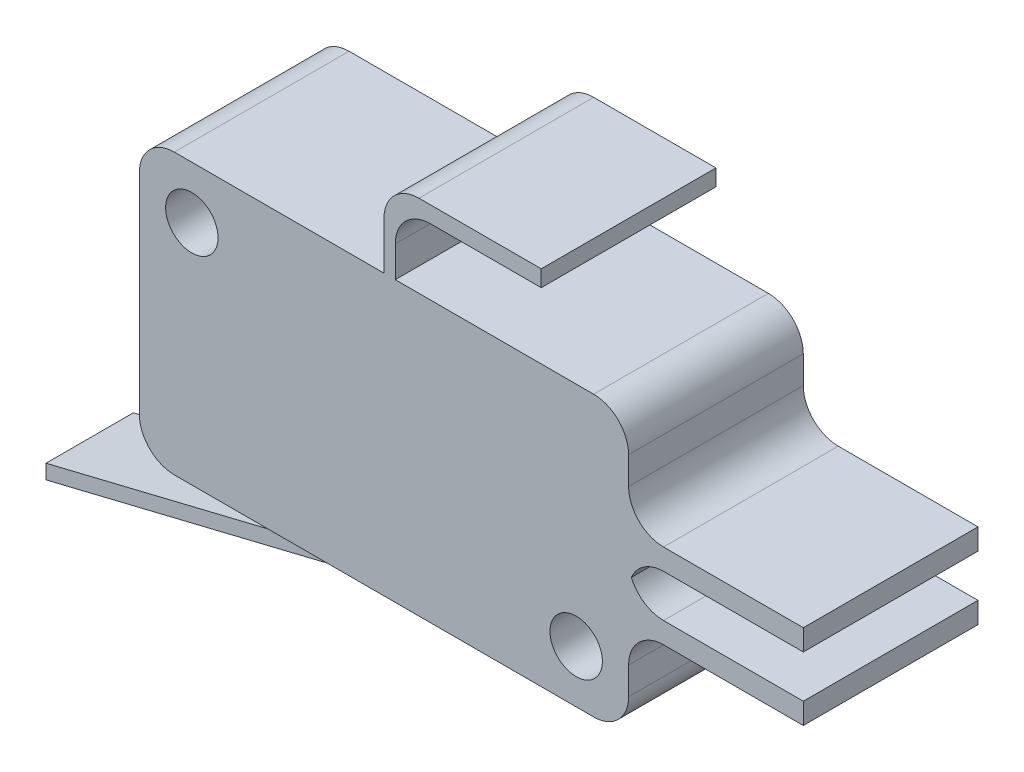
ISO-10303-21;
HEADER;
FILE_DESCRIPTION(('STEP AP214'),'2;1');
FILE_NAME('part.step','',(''),(''),'','','');
FILE_SCHEMA(('AUTOMOTIVE_DESIGN { 1 0 10303 214 1 1 1 1 }'));
ENDSEC;
DATA;
#1=APPLICATION_CONTEXT('core data for automotive mechanical design processes');
#2=APPLICATION_PROTOCOL_DEFINITION('international standard','automotive_design',2000,#1);
#3=PRODUCT_CONTEXT('',#1,'mechanical');
#4=PRODUCT('Part','Part','',(#3));
#5=PRODUCT_RELATED_PRODUCT_CATEGORY('part','',(#4));
#6=PRODUCT_DEFINITION_FORMATION('','',#4);
#7=PRODUCT_DEFINITION_CONTEXT('part definition',#1,'design');
#8=PRODUCT_DEFINITION('design','',#6,#7);
#9=PRODUCT_DEFINITION_SHAPE('','',#8);
#10=(LENGTH_UNIT() NAMED_UNIT(*) SI_UNIT(.MILLI.,.METRE.));
#11=(NAMED_UNIT(*) PLANE_ANGLE_UNIT() SI_UNIT($,.RADIAN.));
#12=(NAMED_UNIT(*) SI_UNIT($,.STERADIAN.) SOLID_ANGLE_UNIT());
#13=UNCERTAINTY_MEASURE_WITH_UNIT(LENGTH_MEASURE(1.E-05),#10,'distance_accuracy_value','');
#14=(GEOMETRIC_REPRESENTATION_CONTEXT(3) GLOBAL_UNCERTAINTY_ASSIGNED_CONTEXT((#13)) GLOBAL_UNIT_ASSIGNED_CONTEXT((#10,
#11,#12)) REPRESENTATION_CONTEXT('',''));
#15=CARTESIAN_POINT('',(0.,0.,0.));
#16=DIRECTION('',(0.,0.,1.));
#17=DIRECTION('',(1.,0.,0.));
#18=AXIS2_PLACEMENT_3D('',#15,#16,#17);
#19=CARTESIAN_POINT('',(-21.8467532467533,-13.5942311593861,2.5));
#20=DIRECTION('',(0.236765486364074,-0.971566829645179,0.));
#21=DIRECTION('',(0.971566829645179,0.236765486364074,0.));
#22=AXIS2_PLACEMENT_3D('',#19,#20,#21);
#23=PLANE('',#22);
#24=DIRECTION('',(0.971566829645179,0.236765486364074,0.));
#25=VECTOR('',#24,1.);
#26=CARTESIAN_POINT('',(-21.8467532467533,-13.5942311593861,7.5));
#27=LINE('',#26,#25);
#28=CARTESIAN_POINT('',(-21.8467532467533,-13.5942311593861,7.5));
#29=VERTEX_POINT('',#28);
#30=CARTESIAN_POINT('',(1.10916619612272,-8.,7.5));
#31=VERTEX_POINT('',#30);
#32=EDGE_CURVE('E98',#29,#31,#27,.T.);
#33=ORIENTED_EDGE('',*,*,#32,.T.);
#34=DIRECTION('',(0.,0.,1.));
#35=VECTOR('',#34,1.);
#36=CARTESIAN_POINT('',(1.10916619612272,-8.,2.5));
#37=LINE('',#36,#35);
#38=CARTESIAN_POINT('',(1.10916619612272,-8.,2.5));
#39=VERTEX_POINT('',#38);
#40=EDGE_CURVE('E96',#39,#31,#37,.T.);
#41=ORIENTED_EDGE('',*,*,#40,.F.);
#42=DIRECTION('',(0.971566829645179,0.236765486364074,0.));
#43=VECTOR('',#42,1.);
#44=CARTESIAN_POINT('',(-21.8467532467533,-13.5942311593861,2.5));
#45=LINE('',#44,#43);
#46=CARTESIAN_POINT('',(-21.8467532467533,-13.5942311593861,2.5));
#47=VERTEX_POINT('',#46);
#48=EDGE_CURVE('E84',#47,#39,#45,.T.);
#49=ORIENTED_EDGE('',*,*,#48,.F.);
#50=DIRECTION('',(0.,0.,1.));
#51=VECTOR('',#50,1.);
#52=CARTESIAN_POINT('',(-21.8467532467533,-13.5942311593861,2.5));
#53=LINE('',#52,#51);
#54=EDGE_CURVE('E108',#47,#29,#53,.T.);
#55=ORIENTED_EDGE('',*,*,#54,.T.);
#56=EDGE_LOOP('',(#33,#41,#49,#55));
#57=FACE_BOUND('',#56,.T.);
#58=ADVANCED_FACE('F47',(#57),#23,.F.);
#59=CARTESIAN_POINT('',(1.10916619612272,-8.82795974963643,2.5));
#60=DIRECTION('',(-0.236719240086586,0.971578098442338,0.));
#61=DIRECTION('',(-0.971578098442338,-0.236719240086586,0.));
#62=AXIS2_PLACEMENT_3D('',#59,#60,#61);
#63=PLANE('',#62);
#64=DIRECTION('',(-0.971578098442338,-0.236719240086586,0.));
#65=VECTOR('',#64,1.);
#66=CARTESIAN_POINT('',(1.10916619612272,-8.82795974963643,2.5));
#67=LINE('',#66,#65);
#68=CARTESIAN_POINT('',(-0.258152289868921,-9.16109878753694,2.5));
#69=VERTEX_POINT('',#68);
#70=CARTESIAN_POINT('',(-21.8467532467533,-14.42103334271,2.5));
#71=VERTEX_POINT('',#70);
#72=EDGE_CURVE('E92',#69,#71,#67,.T.);
#73=ORIENTED_EDGE('',*,*,#72,.F.);
#74=DIRECTION('',(0.,0.,1.));
#75=VECTOR('',#74,1.);
#76=CARTESIAN_POINT('',(-0.258152289868921,-9.16109878753694,2.5));
#77=LINE('',#76,#75);
#78=CARTESIAN_POINT('',(-0.258152289868921,-9.16109878753694,7.5));
#79=VERTEX_POINT('',#78);
#80=EDGE_CURVE('E99',#69,#79,#77,.T.);
#81=ORIENTED_EDGE('',*,*,#80,.T.);
#82=DIRECTION('',(-0.971578098442338,-0.236719240086586,0.));
#83=VECTOR('',#82,1.);
#84=CARTESIAN_POINT('',(1.10916619612272,-8.82795974963643,7.5));
#85=LINE('',#84,#83);
#86=CARTESIAN_POINT('',(-21.8467532467533,-14.42103334271,7.5));
#87=VERTEX_POINT('',#86);
#88=EDGE_CURVE('E111',#79,#87,#85,.T.);
#89=ORIENTED_EDGE('',*,*,#88,.T.);
#90=DIRECTION('',(0.,0.,1.));
#91=VECTOR('',#90,1.);
#92=CARTESIAN_POINT('',(-21.8467532467533,-14.42103334271,2.5));
#93=LINE('',#92,#91);
#94=EDGE_CURVE('E100',#71,#87,#93,.T.);
#95=ORIENTED_EDGE('',*,*,#94,.F.);
#96=EDGE_LOOP('',(#73,#81,#89,#95));
#97=FACE_BOUND('',#96,.T.);
#98=ADVANCED_FACE('F116',(#97),#63,.F.);
#99=CARTESIAN_POINT('',(-21.8467532467533,-14.42103334271,2.5));
#100=DIRECTION('',(1.,0.,0.));
#101=DIRECTION('',(0.,0.,-1.));
#102=AXIS2_PLACEMENT_3D('',#99,#100,#101);
#103=PLANE('',#102);
#104=DIRECTION('',(0.,1.,0.));
#105=VECTOR('',#104,1.);
#106=CARTESIAN_POINT('',(-21.8467532467533,-14.42103334271,7.5));
#107=LINE('',#106,#105);
#108=EDGE_CURVE('E93',#87,#29,#107,.T.);
#109=ORIENTED_EDGE('',*,*,#108,.T.);
#110=ORIENTED_EDGE('',*,*,#54,.F.);
#111=DIRECTION('',(0.,1.,0.));
#112=VECTOR('',#111,1.);
#113=CARTESIAN_POINT('',(-21.8467532467533,-14.42103334271,2.5));
#114=LINE('',#113,#112);
#115=EDGE_CURVE('E88',#71,#47,#114,.T.);
#116=ORIENTED_EDGE('',*,*,#115,.F.);
#117=ORIENTED_EDGE('',*,*,#94,.T.);
#118=EDGE_LOOP('',(#109,#110,#116,#117));
#119=FACE_BOUND('',#118,.T.);
#120=ADVANCED_FACE('F119',(#119),#103,.F.);
#121=CARTESIAN_POINT('',(0.,0.,2.5));
#122=DIRECTION('',(0.,0.,-1.));
#123=DIRECTION('',(-1.,0.,0.));
#124=AXIS2_PLACEMENT_3D('',#121,#122,#123);
#125=PLANE('',#124);
#126=ORIENTED_EDGE('',*,*,#48,.T.);
#127=CARTESIAN_POINT('',(-0.731590770042094,-7.21794259065226,2.5));
#128=DIRECTION('',(0.,0.,-1.));
#129=DIRECTION('',(-1.,0.,0.));
#130=AXIS2_PLACEMENT_3D('',#127,#128,#129);
#131=CIRCLE('',#130,2.);
#132=EDGE_CURVE('E12',#39,#69,#131,.T.);
#133=ORIENTED_EDGE('',*,*,#132,.T.);
#134=ORIENTED_EDGE('',*,*,#72,.T.);
#135=ORIENTED_EDGE('',*,*,#115,.T.);
#136=EDGE_LOOP('',(#126,#133,#134,#135));
#137=FACE_BOUND('',#136,.T.);
#138=ADVANCED_FACE('F86',(#137),#125,.T.);
#139=CARTESIAN_POINT('',(0.,0.,7.5));
#140=DIRECTION('',(0.,0.,-1.));
#141=DIRECTION('',(-1.,0.,0.));
#142=AXIS2_PLACEMENT_3D('',#139,#140,#141);
#143=PLANE('',#142);
#144=ORIENTED_EDGE('',*,*,#88,.F.);
#145=CARTESIAN_POINT('',(-0.731590770042094,-7.21794259065226,7.5));
#146=DIRECTION('',(0.,0.,-1.));
#147=DIRECTION('',(-1.,0.,0.));
#148=AXIS2_PLACEMENT_3D('',#145,#146,#147);
#149=CIRCLE('',#148,2.);
#150=EDGE_CURVE('E55',#79,#31,#149,.F.);
#151=ORIENTED_EDGE('',*,*,#150,.T.);
#152=ORIENTED_EDGE('',*,*,#32,.F.);
#153=ORIENTED_EDGE('',*,*,#108,.F.);
#154=EDGE_LOOP('',(#144,#151,#152,#153));
#155=FACE_BOUND('',#154,.T.);
#156=ADVANCED_FACE('F121',(#155),#143,.F.);
#157=CARTESIAN_POINT('',(-0.731590770042094,-7.21794259065226,2.5));
#158=DIRECTION('',(0.,0.,1.));
#159=DIRECTION('',(1.,0.,0.));
#160=AXIS2_PLACEMENT_3D('',#157,#158,#159);
#161=CYLINDRICAL_SURFACE('',#160,2.);
#162=ORIENTED_EDGE('',*,*,#132,.F.);
#163=ORIENTED_EDGE('',*,*,#40,.T.);
#164=ORIENTED_EDGE('',*,*,#150,.F.);
#165=ORIENTED_EDGE('',*,*,#80,.F.);
#166=EDGE_LOOP('',(#162,#163,#164,#165));
#167=FACE_BOUND('',#166,.T.);
#168=ADVANCED_FACE('F49',(#167),#161,.T.);
#169=CLOSED_SHELL('',(#58,#98,#120,#138,#156,#168));
#170=MANIFOLD_SOLID_BREP('B2',#169);
#171=CARTESIAN_POINT('',(0.,0.,10.));
#172=DIRECTION('',(0.,0.,-1.));
#173=DIRECTION('',(-1.,0.,0.));
#174=AXIS2_PLACEMENT_3D('',#171,#172,#173);
#175=PLANE('',#174);
#176=DIRECTION('',(0.,-1.,0.));
#177=VECTOR('',#176,1.);
#178=CARTESIAN_POINT('',(-14.,-8.,10.));
#179=LINE('',#178,#177);
#180=CARTESIAN_POINT('',(-14.,6.,10.));
#181=VERTEX_POINT('',#180);
#182=CARTESIAN_POINT('',(-14.,-6.,10.));
#183=VERTEX_POINT('',#182);
#184=EDGE_CURVE('E594',#181,#183,#179,.T.);
#185=ORIENTED_EDGE('',*,*,#184,.T.);
#186=CARTESIAN_POINT('',(-12.,-6.,10.));
#187=DIRECTION('',(0.,0.,-1.));
#188=DIRECTION('',(-1.,0.,0.));
#189=AXIS2_PLACEMENT_3D('',#186,#187,#188);
#190=CIRCLE('',#189,2.);
#191=CARTESIAN_POINT('',(-12.,-8.,10.));
#192=VERTEX_POINT('',#191);
#193=EDGE_CURVE('E496',#183,#192,#190,.F.);
#194=ORIENTED_EDGE('',*,*,#193,.T.);
#195=DIRECTION('',(1.,0.,0.));
#196=VECTOR('',#195,1.);
#197=CARTESIAN_POINT('',(3.48316240501183,-8.,10.));
#198=LINE('',#197,#196);
#199=CARTESIAN_POINT('',(12.,-8.,10.));
#200=VERTEX_POINT('',#199);
#201=EDGE_CURVE('E599',#192,#200,#198,.T.);
#202=ORIENTED_EDGE('',*,*,#201,.T.);
#203=CARTESIAN_POINT('',(12.,-6.,10.));
#204=DIRECTION('',(0.,0.,-1.));
#205=DIRECTION('',(-1.,0.,0.));
#206=AXIS2_PLACEMENT_3D('',#203,#204,#205);
#207=CIRCLE('',#206,2.);
#208=CARTESIAN_POINT('',(14.,-6.,10.));
#209=VERTEX_POINT('',#208);
#210=EDGE_CURVE('E488',#200,#209,#207,.F.);
#211=ORIENTED_EDGE('',*,*,#210,.T.);
#212=DIRECTION('',(0.,1.,0.));
#213=VECTOR('',#212,1.);
#214=CARTESIAN_POINT('',(14.,-8.,10.));
#215=LINE('',#214,#213);
#216=CARTESIAN_POINT('',(14.,-4.42408412748578,10.));
#217=VERTEX_POINT('',#216);
#218=EDGE_CURVE('E362',#209,#217,#215,.T.);
#219=ORIENTED_EDGE('',*,*,#218,.T.);
#220=CARTESIAN_POINT('',(16.,-4.42408412748578,10.));
#221=DIRECTION('',(0.,0.,-1.));
#222=DIRECTION('',(-1.,0.,0.));
#223=AXIS2_PLACEMENT_3D('',#220,#221,#222);
#224=CIRCLE('',#223,2.);
#225=CARTESIAN_POINT('',(16.,-2.42408412748578,10.));
#226=VERTEX_POINT('',#225);
#227=EDGE_CURVE('E358',#217,#226,#224,.T.);
#228=ORIENTED_EDGE('',*,*,#227,.T.);
#229=DIRECTION('',(1.,0.,0.));
#230=VECTOR('',#229,1.);
#231=CARTESIAN_POINT('',(14.,-2.42408412748578,10.));
#232=LINE('',#231,#230);
#233=CARTESIAN_POINT('',(24.,-2.42408412748578,10.));
#234=VERTEX_POINT('',#233);
#235=EDGE_CURVE('E349',#226,#234,#232,.T.);
#236=ORIENTED_EDGE('',*,*,#235,.T.);
#237=DIRECTION('',(0.,1.,0.));
#238=VECTOR('',#237,1.);
#239=CARTESIAN_POINT('',(24.,-2.42408412748578,10.));
#240=LINE('',#239,#238);
#241=CARTESIAN_POINT('',(24.,-1.21872586255045,10.));
#242=VERTEX_POINT('',#241);
#243=EDGE_CURVE('E354',#234,#242,#240,.T.);
#244=ORIENTED_EDGE('',*,*,#243,.T.);
#245=DIRECTION('',(-1.,0.,0.));
#246=VECTOR('',#245,1.);
#247=CARTESIAN_POINT('',(24.,-1.21872586255045,10.));
#248=LINE('',#247,#246);
#249=CARTESIAN_POINT('',(16.,-1.21872586255045,10.));
#250=VERTEX_POINT('',#249);
#251=EDGE_CURVE('E377',#242,#250,#248,.T.);
#252=ORIENTED_EDGE('',*,*,#251,.T.);
#253=CARTESIAN_POINT('',(16.,0.781274137449547,10.));
#254=DIRECTION('',(0.,0.,-1.));
#255=DIRECTION('',(-1.,0.,0.));
#256=AXIS2_PLACEMENT_3D('',#253,#254,#255);
#257=CIRCLE('',#256,2.);
#258=CARTESIAN_POINT('',(14.1589104524352,0.,10.));
#259=VERTEX_POINT('',#258);
#260=EDGE_CURVE('E187',#250,#259,#257,.T.);
#261=ORIENTED_EDGE('',*,*,#260,.T.);
#262=CARTESIAN_POINT('',(16.,-0.78127413744955,10.));
#263=DIRECTION('',(0.,0.,-1.));
#264=DIRECTION('',(-1.,0.,0.));
#265=AXIS2_PLACEMENT_3D('',#262,#263,#264);
#266=CIRCLE('',#265,2.);
#267=CARTESIAN_POINT('',(16.,1.21872586255045,10.));
#268=VERTEX_POINT('',#267);
#269=EDGE_CURVE('E536',#259,#268,#266,.T.);
#270=ORIENTED_EDGE('',*,*,#269,.T.);
#271=DIRECTION('',(1.,0.,0.));
#272=VECTOR('',#271,1.);
#273=CARTESIAN_POINT('',(24.,1.21872586255045,10.));
#274=LINE('',#273,#272);
#275=CARTESIAN_POINT('',(24.,1.21872586255045,10.));
#276=VERTEX_POINT('',#275);
#277=EDGE_CURVE('E379',#268,#276,#274,.T.);
#278=ORIENTED_EDGE('',*,*,#277,.T.);
#279=DIRECTION('',(0.,1.,0.));
#280=VECTOR('',#279,1.);
#281=CARTESIAN_POINT('',(24.,2.42408412748578,10.));
#282=LINE('',#281,#280);
#283=CARTESIAN_POINT('',(24.,2.42408412748578,10.));
#284=VERTEX_POINT('',#283);
#285=EDGE_CURVE('E384',#276,#284,#282,.T.);
#286=ORIENTED_EDGE('',*,*,#285,.T.);
#287=DIRECTION('',(-1.,0.,0.));
#288=VECTOR('',#287,1.);
#289=CARTESIAN_POINT('',(14.,2.42408412748578,10.));
#290=LINE('',#289,#288);
#291=CARTESIAN_POINT('',(16.,2.42408412748578,10.));
#292=VERTEX_POINT('',#291);
#293=EDGE_CURVE('E386',#284,#292,#290,.T.);
#294=ORIENTED_EDGE('',*,*,#293,.T.);
#295=CARTESIAN_POINT('',(16.,4.42408412748578,10.));
#296=DIRECTION('',(0.,0.,-1.));
#297=DIRECTION('',(-1.,0.,0.));
#298=AXIS2_PLACEMENT_3D('',#295,#296,#297);
#299=CIRCLE('',#298,2.);
#300=CARTESIAN_POINT('',(14.,4.42408412748578,10.));
#301=VERTEX_POINT('',#300);
#302=EDGE_CURVE('E540',#292,#301,#299,.T.);
#303=ORIENTED_EDGE('',*,*,#302,.T.);
#304=DIRECTION('',(0.,1.,0.));
#305=VECTOR('',#304,1.);
#306=CARTESIAN_POINT('',(14.,2.42408412748578,10.));
#307=LINE('',#306,#305);
#308=CARTESIAN_POINT('',(14.,6.,10.));
#309=VERTEX_POINT('',#308);
#310=EDGE_CURVE('E389',#301,#309,#307,.T.);
#311=ORIENTED_EDGE('',*,*,#310,.T.);
#312=CARTESIAN_POINT('',(12.,6.,10.));
#313=DIRECTION('',(0.,0.,-1.));
#314=DIRECTION('',(-1.,0.,0.));
#315=AXIS2_PLACEMENT_3D('',#312,#313,#314);
#316=CIRCLE('',#315,2.);
#317=CARTESIAN_POINT('',(12.,8.,10.));
#318=VERTEX_POINT('',#317);
#319=EDGE_CURVE('E492',#309,#318,#316,.F.);
#320=ORIENTED_EDGE('',*,*,#319,.T.);
#321=DIRECTION('',(-1.,0.,0.));
#322=VECTOR('',#321,1.);
#323=CARTESIAN_POINT('',(14.,8.,10.));
#324=LINE('',#323,#322);
#325=CARTESIAN_POINT('',(0.647378107688678,8.,10.));
#326=VERTEX_POINT('',#325);
#327=EDGE_CURVE('E392',#318,#326,#324,.T.);
#328=ORIENTED_EDGE('',*,*,#327,.T.);
#329=DIRECTION('',(0.,1.,0.));
#330=VECTOR('',#329,1.);
#331=CARTESIAN_POINT('',(0.647378107688678,8.,10.));
#332=LINE('',#331,#330);
#333=CARTESIAN_POINT('',(0.647378107688678,9.7780684753102,10.));
#334=VERTEX_POINT('',#333);
#335=EDGE_CURVE('E394',#326,#334,#332,.T.);
#336=ORIENTED_EDGE('',*,*,#335,.T.);
#337=CARTESIAN_POINT('',(2.64737810768868,9.7780684753102,10.));
#338=DIRECTION('',(0.,0.,-1.));
#339=DIRECTION('',(-1.,0.,0.));
#340=AXIS2_PLACEMENT_3D('',#337,#338,#339);
#341=CIRCLE('',#340,2.);
#342=CARTESIAN_POINT('',(2.64737810768868,11.7780684753102,10.));
#343=VERTEX_POINT('',#342);
#344=EDGE_CURVE('E45',#334,#343,#341,.T.);
#345=ORIENTED_EDGE('',*,*,#344,.T.);
#346=DIRECTION('',(1.,0.,0.));
#347=VECTOR('',#346,1.);
#348=CARTESIAN_POINT('',(0.647378107688678,11.7780684753102,10.));
#349=LINE('',#348,#347);
#350=CARTESIAN_POINT('',(9.,11.7780684753102,10.));
#351=VERTEX_POINT('',#350);
#352=EDGE_CURVE('E397',#343,#351,#349,.T.);
#353=ORIENTED_EDGE('',*,*,#352,.T.);
#354=DIRECTION('',(0.,1.,0.));
#355=VECTOR('',#354,1.);
#356=CARTESIAN_POINT('',(9.,11.7780684753102,10.));
#357=LINE('',#356,#355);
#358=CARTESIAN_POINT('',(9.,12.7163748730215,10.));
#359=VERTEX_POINT('',#358);
#360=EDGE_CURVE('E399',#351,#359,#357,.T.);
#361=ORIENTED_EDGE('',*,*,#360,.T.);
#362=DIRECTION('',(-1.,0.,0.));
#363=VECTOR('',#362,1.);
#364=CARTESIAN_POINT('',(0.,12.7163748730215,10.));
#365=LINE('',#364,#363);
#366=CARTESIAN_POINT('',(2.,12.7163748730215,10.));
#367=VERTEX_POINT('',#366);
#368=EDGE_CURVE('E401',#359,#367,#365,.T.);
#369=ORIENTED_EDGE('',*,*,#368,.T.);
#370=CARTESIAN_POINT('',(2.,10.7163748730215,10.));
#371=DIRECTION('',(0.,0.,-1.));
#372=DIRECTION('',(-1.,0.,0.));
#373=AXIS2_PLACEMENT_3D('',#370,#371,#372);
#374=CIRCLE('',#373,2.);
#375=CARTESIAN_POINT('',(0.,10.7163748730215,10.));
#376=VERTEX_POINT('',#375);
#377=EDGE_CURVE('E494',#367,#376,#374,.F.);
#378=ORIENTED_EDGE('',*,*,#377,.T.);
#379=DIRECTION('',(0.,-1.,0.));
#380=VECTOR('',#379,1.);
#381=CARTESIAN_POINT('',(0.,8.,10.));
#382=LINE('',#381,#380);
#383=CARTESIAN_POINT('',(0.,8.,10.));
#384=VERTEX_POINT('',#383);
#385=EDGE_CURVE('E404',#376,#384,#382,.T.);
#386=ORIENTED_EDGE('',*,*,#385,.T.);
#387=DIRECTION('',(-1.,0.,0.));
#388=VECTOR('',#387,1.);
#389=CARTESIAN_POINT('',(0.,8.,10.));
#390=LINE('',#389,#388);
#391=CARTESIAN_POINT('',(-12.,8.,10.));
#392=VERTEX_POINT('',#391);
#393=EDGE_CURVE('E450',#384,#392,#390,.T.);
#394=ORIENTED_EDGE('',*,*,#393,.T.);
#395=CARTESIAN_POINT('',(-12.,6.,10.));
#396=DIRECTION('',(0.,0.,-1.));
#397=DIRECTION('',(-1.,0.,0.));
#398=AXIS2_PLACEMENT_3D('',#395,#396,#397);
#399=CIRCLE('',#398,2.);
#400=EDGE_CURVE('E490',#392,#181,#399,.F.);
#401=ORIENTED_EDGE('',*,*,#400,.T.);
#402=EDGE_LOOP('',(#185,#194,#202,#211,#219,#228,#236,#244,#252,#261,#270,#278,#286,#294,#303,
#311,#320,#328,#336,#345,#353,#361,#369,#378,#386,#394,#401));
#403=FACE_BOUND('',#402,.T.);
#404=CARTESIAN_POINT('',(-11.,5.,10.));
#405=DIRECTION('',(0.,0.,1.));
#406=DIRECTION('',(1.,0.,0.));
#407=AXIS2_PLACEMENT_3D('',#404,#405,#406);
#408=CIRCLE('',#407,1.5);
#409=CARTESIAN_POINT('',(-9.5,5.,10.));
#410=VERTEX_POINT('',#409);
#411=EDGE_CURVE('E411',#410,#410,#408,.T.);
#412=ORIENTED_EDGE('',*,*,#411,.F.);
#413=EDGE_LOOP('',(#412));
#414=FACE_BOUND('',#413,.T.);
#415=CARTESIAN_POINT('',(11.,-5.,10.));
#416=DIRECTION('',(0.,0.,1.));
#417=DIRECTION('',(1.,0.,0.));
#418=AXIS2_PLACEMENT_3D('',#415,#416,#417);
#419=CIRCLE('',#418,1.5);
#420=CARTESIAN_POINT('',(12.5,-5.,10.));
#421=VERTEX_POINT('',#420);
#422=EDGE_CURVE('E624',#421,#421,#419,.T.);
#423=ORIENTED_EDGE('',*,*,#422,.F.);
#424=EDGE_LOOP('',(#423));
#425=FACE_BOUND('',#424,.T.);
#426=ADVANCED_FACE('F171',(#403,#414,#425),#175,.F.);
#427=CARTESIAN_POINT('',(0.,0.,0.));
#428=DIRECTION('',(0.,0.,-1.));
#429=DIRECTION('',(-1.,0.,0.));
#430=AXIS2_PLACEMENT_3D('',#427,#428,#429);
#431=PLANE('',#430);
#432=CARTESIAN_POINT('',(-11.,5.,0.));
#433=DIRECTION('',(0.,0.,1.));
#434=DIRECTION('',(1.,0.,0.));
#435=AXIS2_PLACEMENT_3D('',#432,#433,#434);
#436=CIRCLE('',#435,1.5);
#437=CARTESIAN_POINT('',(-9.5,5.,0.));
#438=VERTEX_POINT('',#437);
#439=EDGE_CURVE('E628',#438,#438,#436,.T.);
#440=ORIENTED_EDGE('',*,*,#439,.T.);
#441=EDGE_LOOP('',(#440));
#442=FACE_BOUND('',#441,.T.);
#443=DIRECTION('',(1.,0.,0.));
#444=VECTOR('',#443,1.);
#445=CARTESIAN_POINT('',(14.,-8.,0.));
#446=LINE('',#445,#444);
#447=CARTESIAN_POINT('',(-12.,-8.,0.));
#448=VERTEX_POINT('',#447);
#449=CARTESIAN_POINT('',(12.,-8.,0.));
#450=VERTEX_POINT('',#449);
#451=EDGE_CURVE('E414',#448,#450,#446,.T.);
#452=ORIENTED_EDGE('',*,*,#451,.F.);
#453=CARTESIAN_POINT('',(-12.,-6.,0.));
#454=DIRECTION('',(0.,0.,-1.));
#455=DIRECTION('',(-1.,0.,0.));
#456=AXIS2_PLACEMENT_3D('',#453,#454,#455);
#457=CIRCLE('',#456,2.);
#458=CARTESIAN_POINT('',(-14.,-6.,0.));
#459=VERTEX_POINT('',#458);
#460=EDGE_CURVE('E481',#448,#459,#457,.T.);
#461=ORIENTED_EDGE('',*,*,#460,.T.);
#462=DIRECTION('',(0.,-1.,0.));
#463=VECTOR('',#462,1.);
#464=CARTESIAN_POINT('',(-14.,-8.,0.));
#465=LINE('',#464,#463);
#466=CARTESIAN_POINT('',(-14.,6.,0.));
#467=VERTEX_POINT('',#466);
#468=EDGE_CURVE('E410',#467,#459,#465,.T.);
#469=ORIENTED_EDGE('',*,*,#468,.F.);
#470=CARTESIAN_POINT('',(-12.,6.,0.));
#471=DIRECTION('',(0.,0.,-1.));
#472=DIRECTION('',(-1.,0.,0.));
#473=AXIS2_PLACEMENT_3D('',#470,#471,#472);
#474=CIRCLE('',#473,2.);
#475=CARTESIAN_POINT('',(-12.,8.,0.));
#476=VERTEX_POINT('',#475);
#477=EDGE_CURVE('E475',#467,#476,#474,.T.);
#478=ORIENTED_EDGE('',*,*,#477,.T.);
#479=DIRECTION('',(-1.,0.,0.));
#480=VECTOR('',#479,1.);
#481=CARTESIAN_POINT('',(0.,8.,0.));
#482=LINE('',#481,#480);
#483=CARTESIAN_POINT('',(0.,8.,0.));
#484=VERTEX_POINT('',#483);
#485=EDGE_CURVE('E407',#484,#476,#482,.T.);
#486=ORIENTED_EDGE('',*,*,#485,.F.);
#487=DIRECTION('',(0.,-1.,0.));
#488=VECTOR('',#487,1.);
#489=CARTESIAN_POINT('',(0.,8.,0.));
#490=LINE('',#489,#488);
#491=CARTESIAN_POINT('',(0.,10.7163748730215,0.));
#492=VERTEX_POINT('',#491);
#493=EDGE_CURVE('E448',#492,#484,#490,.T.);
#494=ORIENTED_EDGE('',*,*,#493,.F.);
#495=CARTESIAN_POINT('',(2.,10.7163748730215,0.));
#496=DIRECTION('',(0.,0.,-1.));
#497=DIRECTION('',(-1.,0.,0.));
#498=AXIS2_PLACEMENT_3D('',#495,#496,#497);
#499=CIRCLE('',#498,2.);
#500=CARTESIAN_POINT('',(2.,12.7163748730215,0.));
#501=VERTEX_POINT('',#500);
#502=EDGE_CURVE('E479',#492,#501,#499,.T.);
#503=ORIENTED_EDGE('',*,*,#502,.T.);
#504=DIRECTION('',(-1.,0.,0.));
#505=VECTOR('',#504,1.);
#506=CARTESIAN_POINT('',(0.,12.7163748730215,0.));
#507=LINE('',#506,#505);
#508=CARTESIAN_POINT('',(9.,12.7163748730215,0.));
#509=VERTEX_POINT('',#508);
#510=EDGE_CURVE('E445',#509,#501,#507,.T.);
#511=ORIENTED_EDGE('',*,*,#510,.F.);
#512=DIRECTION('',(0.,1.,0.));
#513=VECTOR('',#512,1.);
#514=CARTESIAN_POINT('',(9.,11.7780684753102,0.));
#515=LINE('',#514,#513);
#516=CARTESIAN_POINT('',(9.,11.7780684753102,0.));
#517=VERTEX_POINT('',#516);
#518=EDGE_CURVE('E443',#517,#509,#515,.T.);
#519=ORIENTED_EDGE('',*,*,#518,.F.);
#520=DIRECTION('',(1.,0.,0.));
#521=VECTOR('',#520,1.);
#522=CARTESIAN_POINT('',(0.647378107688678,11.7780684753102,0.));
#523=LINE('',#522,#521);
#524=CARTESIAN_POINT('',(2.64737810768868,11.7780684753102,0.));
#525=VERTEX_POINT('',#524);
#526=EDGE_CURVE('E441',#525,#517,#523,.T.);
#527=ORIENTED_EDGE('',*,*,#526,.F.);
#528=CARTESIAN_POINT('',(2.64737810768868,9.7780684753102,0.));
#529=DIRECTION('',(0.,0.,-1.));
#530=DIRECTION('',(-1.,0.,0.));
#531=AXIS2_PLACEMENT_3D('',#528,#529,#530);
#532=CIRCLE('',#531,2.);
#533=CARTESIAN_POINT('',(0.647378107688678,9.7780684753102,0.));
#534=VERTEX_POINT('',#533);
#535=EDGE_CURVE('E180',#525,#534,#532,.F.);
#536=ORIENTED_EDGE('',*,*,#535,.T.);
#537=DIRECTION('',(0.,1.,0.));
#538=VECTOR('',#537,1.);
#539=CARTESIAN_POINT('',(0.647378107688678,8.,0.));
#540=LINE('',#539,#538);
#541=CARTESIAN_POINT('',(0.647378107688678,8.,0.));
#542=VERTEX_POINT('',#541);
#543=EDGE_CURVE('E438',#542,#534,#540,.T.);
#544=ORIENTED_EDGE('',*,*,#543,.F.);
#545=DIRECTION('',(-1.,0.,0.));
#546=VECTOR('',#545,1.);
#547=CARTESIAN_POINT('',(14.,8.,0.));
#548=LINE('',#547,#546);
#549=CARTESIAN_POINT('',(12.,8.,0.));
#550=VERTEX_POINT('',#549);
#551=EDGE_CURVE('E436',#550,#542,#548,.T.);
#552=ORIENTED_EDGE('',*,*,#551,.F.);
#553=CARTESIAN_POINT('',(12.,6.,0.));
#554=DIRECTION('',(0.,0.,-1.));
#555=DIRECTION('',(-1.,0.,0.));
#556=AXIS2_PLACEMENT_3D('',#553,#554,#555);
#557=CIRCLE('',#556,2.);
#558=CARTESIAN_POINT('',(14.,6.,0.));
#559=VERTEX_POINT('',#558);
#560=EDGE_CURVE('E477',#550,#559,#557,.T.);
#561=ORIENTED_EDGE('',*,*,#560,.T.);
#562=DIRECTION('',(0.,1.,0.));
#563=VECTOR('',#562,1.);
#564=CARTESIAN_POINT('',(14.,2.42408412748578,0.));
#565=LINE('',#564,#563);
#566=CARTESIAN_POINT('',(14.,4.42408412748578,0.));
#567=VERTEX_POINT('',#566);
#568=EDGE_CURVE('E433',#567,#559,#565,.T.);
#569=ORIENTED_EDGE('',*,*,#568,.F.);
#570=CARTESIAN_POINT('',(16.,4.42408412748578,0.));
#571=DIRECTION('',(0.,0.,-1.));
#572=DIRECTION('',(-1.,0.,0.));
#573=AXIS2_PLACEMENT_3D('',#570,#571,#572);
#574=CIRCLE('',#573,2.);
#575=CARTESIAN_POINT('',(16.,2.42408412748578,0.));
#576=VERTEX_POINT('',#575);
#577=EDGE_CURVE('E538',#567,#576,#574,.F.);
#578=ORIENTED_EDGE('',*,*,#577,.T.);
#579=DIRECTION('',(-1.,0.,0.));
#580=VECTOR('',#579,1.);
#581=CARTESIAN_POINT('',(14.,2.42408412748578,0.));
#582=LINE('',#581,#580);
#583=CARTESIAN_POINT('',(24.,2.42408412748578,0.));
#584=VERTEX_POINT('',#583);
#585=EDGE_CURVE('E430',#584,#576,#582,.T.);
#586=ORIENTED_EDGE('',*,*,#585,.F.);
#587=DIRECTION('',(0.,1.,0.));
#588=VECTOR('',#587,1.);
#589=CARTESIAN_POINT('',(24.,2.42408412748578,0.));
#590=LINE('',#589,#588);
#591=CARTESIAN_POINT('',(24.,1.21872586255045,0.));
#592=VERTEX_POINT('',#591);
#593=EDGE_CURVE('E428',#592,#584,#590,.T.);
#594=ORIENTED_EDGE('',*,*,#593,.F.);
#595=DIRECTION('',(1.,0.,0.));
#596=VECTOR('',#595,1.);
#597=CARTESIAN_POINT('',(24.,1.21872586255045,0.));
#598=LINE('',#597,#596);
#599=CARTESIAN_POINT('',(16.,1.21872586255045,0.));
#600=VERTEX_POINT('',#599);
#601=EDGE_CURVE('E426',#600,#592,#598,.T.);
#602=ORIENTED_EDGE('',*,*,#601,.F.);
#603=CARTESIAN_POINT('',(16.,-0.78127413744955,0.));
#604=DIRECTION('',(0.,0.,-1.));
#605=DIRECTION('',(-1.,0.,0.));
#606=AXIS2_PLACEMENT_3D('',#603,#604,#605);
#607=CIRCLE('',#606,2.);
#608=CARTESIAN_POINT('',(14.1589104524352,0.,0.));
#609=VERTEX_POINT('',#608);
#610=EDGE_CURVE('E195',#600,#609,#607,.F.);
#611=ORIENTED_EDGE('',*,*,#610,.T.);
#612=CARTESIAN_POINT('',(16.,0.781274137449547,0.));
#613=DIRECTION('',(0.,0.,-1.));
#614=DIRECTION('',(-1.,0.,0.));
#615=AXIS2_PLACEMENT_3D('',#612,#613,#614);
#616=CIRCLE('',#615,2.);
#617=CARTESIAN_POINT('',(16.,-1.21872586255045,0.));
#618=VERTEX_POINT('',#617);
#619=EDGE_CURVE('E532',#609,#618,#616,.F.);
#620=ORIENTED_EDGE('',*,*,#619,.T.);
#621=DIRECTION('',(-1.,0.,0.));
#622=VECTOR('',#621,1.);
#623=CARTESIAN_POINT('',(24.,-1.21872586255045,0.));
#624=LINE('',#623,#622);
#625=CARTESIAN_POINT('',(24.,-1.21872586255045,0.));
#626=VERTEX_POINT('',#625);
#627=EDGE_CURVE('E423',#626,#618,#624,.T.);
#628=ORIENTED_EDGE('',*,*,#627,.F.);
#629=DIRECTION('',(0.,1.,0.));
#630=VECTOR('',#629,1.);
#631=CARTESIAN_POINT('',(24.,-2.42408412748578,0.));
#632=LINE('',#631,#630);
#633=CARTESIAN_POINT('',(24.,-2.42408412748578,0.));
#634=VERTEX_POINT('',#633);
#635=EDGE_CURVE('E421',#634,#626,#632,.T.);
#636=ORIENTED_EDGE('',*,*,#635,.F.);
#637=DIRECTION('',(1.,0.,0.));
#638=VECTOR('',#637,1.);
#639=CARTESIAN_POINT('',(14.,-2.42408412748578,0.));
#640=LINE('',#639,#638);
#641=CARTESIAN_POINT('',(16.,-2.42408412748578,0.));
#642=VERTEX_POINT('',#641);
#643=EDGE_CURVE('E368',#642,#634,#640,.T.);
#644=ORIENTED_EDGE('',*,*,#643,.F.);
#645=CARTESIAN_POINT('',(16.,-4.42408412748578,0.));
#646=DIRECTION('',(0.,0.,-1.));
#647=DIRECTION('',(-1.,0.,0.));
#648=AXIS2_PLACEMENT_3D('',#645,#646,#647);
#649=CIRCLE('',#648,2.);
#650=CARTESIAN_POINT('',(14.,-4.42408412748578,0.));
#651=VERTEX_POINT('',#650);
#652=EDGE_CURVE('E542',#642,#651,#649,.F.);
#653=ORIENTED_EDGE('',*,*,#652,.T.);
#654=DIRECTION('',(0.,1.,0.));
#655=VECTOR('',#654,1.);
#656=CARTESIAN_POINT('',(14.,-8.,0.));
#657=LINE('',#656,#655);
#658=CARTESIAN_POINT('',(14.,-6.,0.));
#659=VERTEX_POINT('',#658);
#660=EDGE_CURVE('E417',#659,#651,#657,.T.);
#661=ORIENTED_EDGE('',*,*,#660,.F.);
#662=CARTESIAN_POINT('',(12.,-6.,0.));
#663=DIRECTION('',(0.,0.,-1.));
#664=DIRECTION('',(-1.,0.,0.));
#665=AXIS2_PLACEMENT_3D('',#662,#663,#664);
#666=CIRCLE('',#665,2.);
#667=EDGE_CURVE('E473',#659,#450,#666,.T.);
#668=ORIENTED_EDGE('',*,*,#667,.T.);
#669=EDGE_LOOP('',(#452,#461,#469,#478,#486,#494,#503,#511,#519,#527,#536,#544,#552,#561,#569,
#578,#586,#594,#602,#611,#620,#628,#636,#644,#653,#661,#668));
#670=FACE_BOUND('',#669,.T.);
#671=CARTESIAN_POINT('',(11.,-5.,0.));
#672=DIRECTION('',(0.,0.,1.));
#673=DIRECTION('',(1.,0.,0.));
#674=AXIS2_PLACEMENT_3D('',#671,#672,#673);
#675=CIRCLE('',#674,1.5);
#676=CARTESIAN_POINT('',(12.5,-5.,0.));
#677=VERTEX_POINT('',#676);
#678=EDGE_CURVE('E622',#677,#677,#675,.T.);
#679=ORIENTED_EDGE('',*,*,#678,.T.);
#680=EDGE_LOOP('',(#679));
#681=FACE_BOUND('',#680,.T.);
#682=ADVANCED_FACE('F548',(#442,#670,#681),#431,.T.);
#683=CARTESIAN_POINT('',(0.,8.,10.));
#684=DIRECTION('',(0.,-1.,0.));
#685=DIRECTION('',(1.,0.,0.));
#686=AXIS2_PLACEMENT_3D('',#683,#684,#685);
#687=PLANE('',#686);
#688=ORIENTED_EDGE('',*,*,#485,.T.);
#689=DIRECTION('',(0.,0.,-1.));
#690=VECTOR('',#689,1.);
#691=CARTESIAN_POINT('',(-12.,8.,10.));
#692=LINE('',#691,#690);
#693=EDGE_CURVE('E530',#476,#392,#692,.F.);
#694=ORIENTED_EDGE('',*,*,#693,.T.);
#695=ORIENTED_EDGE('',*,*,#393,.F.);
#696=DIRECTION('',(0.,0.,-1.));
#697=VECTOR('',#696,1.);
#698=CARTESIAN_POINT('',(0.,8.,10.));
#699=LINE('',#698,#697);
#700=EDGE_CURVE('E406',#384,#484,#699,.T.);
#701=ORIENTED_EDGE('',*,*,#700,.T.);
#702=EDGE_LOOP('',(#688,#694,#695,#701));
#703=FACE_BOUND('',#702,.T.);
#704=ADVANCED_FACE('F586',(#703),#687,.F.);
#705=CARTESIAN_POINT('',(-14.,-8.,10.));
#706=DIRECTION('',(1.,0.,0.));
#707=DIRECTION('',(0.,0.,-1.));
#708=AXIS2_PLACEMENT_3D('',#705,#706,#707);
#709=PLANE('',#708);
#710=ORIENTED_EDGE('',*,*,#468,.T.);
#711=DIRECTION('',(0.,0.,-1.));
#712=VECTOR('',#711,1.);
#713=CARTESIAN_POINT('',(-14.,-6.,10.));
#714=LINE('',#713,#712);
#715=EDGE_CURVE('E486',#459,#183,#714,.F.);
#716=ORIENTED_EDGE('',*,*,#715,.T.);
#717=ORIENTED_EDGE('',*,*,#184,.F.);
#718=DIRECTION('',(0.,0.,-1.));
#719=VECTOR('',#718,1.);
#720=CARTESIAN_POINT('',(-14.,6.,10.));
#721=LINE('',#720,#719);
#722=EDGE_CURVE('E483',#181,#467,#721,.T.);
#723=ORIENTED_EDGE('',*,*,#722,.T.);
#724=EDGE_LOOP('',(#710,#716,#717,#723));
#725=FACE_BOUND('',#724,.T.);
#726=ADVANCED_FACE('F597',(#725),#709,.F.);
#727=CARTESIAN_POINT('',(14.,-8.,10.));
#728=DIRECTION('',(0.,1.,0.));
#729=DIRECTION('',(-1.,0.,0.));
#730=AXIS2_PLACEMENT_3D('',#727,#728,#729);
#731=PLANE('',#730);
#732=ORIENTED_EDGE('',*,*,#201,.F.);
#733=DIRECTION('',(0.,0.,-1.));
#734=VECTOR('',#733,1.);
#735=CARTESIAN_POINT('',(-12.,-8.,10.));
#736=LINE('',#735,#734);
#737=EDGE_CURVE('E470',#192,#448,#736,.T.);
#738=ORIENTED_EDGE('',*,*,#737,.T.);
#739=ORIENTED_EDGE('',*,*,#451,.T.);
#740=DIRECTION('',(0.,0.,-1.));
#741=VECTOR('',#740,1.);
#742=CARTESIAN_POINT('',(12.,-8.,10.));
#743=LINE('',#742,#741);
#744=EDGE_CURVE('E371',#450,#200,#743,.F.);
#745=ORIENTED_EDGE('',*,*,#744,.T.);
#746=EDGE_LOOP('',(#732,#738,#739,#745));
#747=FACE_BOUND('',#746,.T.);
#748=ADVANCED_FACE('F694',(#747),#731,.F.);
#749=CARTESIAN_POINT('',(14.,-8.,10.));
#750=DIRECTION('',(-1.,0.,0.));
#751=DIRECTION('',(0.,0.,1.));
#752=AXIS2_PLACEMENT_3D('',#749,#750,#751);
#753=PLANE('',#752);
#754=ORIENTED_EDGE('',*,*,#660,.T.);
#755=DIRECTION('',(0.,0.,-1.));
#756=VECTOR('',#755,1.);
#757=CARTESIAN_POINT('',(14.,-4.42408412748578,10.));
#758=LINE('',#757,#756);
#759=EDGE_CURVE('E520',#651,#217,#758,.F.);
#760=ORIENTED_EDGE('',*,*,#759,.T.);
#761=ORIENTED_EDGE('',*,*,#218,.F.);
#762=DIRECTION('',(0.,0.,-1.));
#763=VECTOR('',#762,1.);
#764=CARTESIAN_POINT('',(14.,-6.,10.));
#765=LINE('',#764,#763);
#766=EDGE_CURVE('E517',#209,#659,#765,.T.);
#767=ORIENTED_EDGE('',*,*,#766,.T.);
#768=EDGE_LOOP('',(#754,#760,#761,#767));
#769=FACE_BOUND('',#768,.T.);
#770=ADVANCED_FACE('F691',(#769),#753,.F.);
#771=CARTESIAN_POINT('',(14.,-2.42408412748578,10.));
#772=DIRECTION('',(0.,1.,0.));
#773=DIRECTION('',(0.,0.,1.));
#774=AXIS2_PLACEMENT_3D('',#771,#772,#773);
#775=PLANE('',#774);
#776=ORIENTED_EDGE('',*,*,#235,.F.);
#777=DIRECTION('',(0.,0.,-1.));
#778=VECTOR('',#777,1.);
#779=CARTESIAN_POINT('',(16.,-2.42408412748578,0.));
#780=LINE('',#779,#778);
#781=EDGE_CURVE('E515',#226,#642,#780,.T.);
#782=ORIENTED_EDGE('',*,*,#781,.T.);
#783=ORIENTED_EDGE('',*,*,#643,.T.);
#784=DIRECTION('',(0.,0.,-1.));
#785=VECTOR('',#784,1.);
#786=CARTESIAN_POINT('',(24.,-2.42408412748578,10.));
#787=LINE('',#786,#785);
#788=EDGE_CURVE('E365',#234,#634,#787,.T.);
#789=ORIENTED_EDGE('',*,*,#788,.F.);
#790=EDGE_LOOP('',(#776,#782,#783,#789));
#791=FACE_BOUND('',#790,.T.);
#792=ADVANCED_FACE('F366',(#791),#775,.F.);
#793=CARTESIAN_POINT('',(24.,-2.42408412748578,10.));
#794=DIRECTION('',(-1.,0.,0.));
#795=DIRECTION('',(0.,0.,1.));
#796=AXIS2_PLACEMENT_3D('',#793,#794,#795);
#797=PLANE('',#796);
#798=ORIENTED_EDGE('',*,*,#635,.T.);
#799=DIRECTION('',(0.,0.,-1.));
#800=VECTOR('',#799,1.);
#801=CARTESIAN_POINT('',(24.,-1.21872586255045,10.));
#802=LINE('',#801,#800);
#803=EDGE_CURVE('E372',#242,#626,#802,.T.);
#804=ORIENTED_EDGE('',*,*,#803,.F.);
#805=ORIENTED_EDGE('',*,*,#243,.F.);
#806=ORIENTED_EDGE('',*,*,#788,.T.);
#807=EDGE_LOOP('',(#798,#804,#805,#806));
#808=FACE_BOUND('',#807,.T.);
#809=ADVANCED_FACE('F374',(#808),#797,.F.);
#810=CARTESIAN_POINT('',(24.,-1.21872586255045,10.));
#811=DIRECTION('',(0.,-1.,0.));
#812=DIRECTION('',(1.,0.,0.));
#813=AXIS2_PLACEMENT_3D('',#810,#811,#812);
#814=PLANE('',#813);
#815=ORIENTED_EDGE('',*,*,#627,.T.);
#816=DIRECTION('',(0.,0.,-1.));
#817=VECTOR('',#816,1.);
#818=CARTESIAN_POINT('',(16.,-1.21872586255045,10.));
#819=LINE('',#818,#817);
#820=EDGE_CURVE('E503',#618,#250,#819,.F.);
#821=ORIENTED_EDGE('',*,*,#820,.T.);
#822=ORIENTED_EDGE('',*,*,#251,.F.);
#823=ORIENTED_EDGE('',*,*,#803,.T.);
#824=EDGE_LOOP('',(#815,#821,#822,#823));
#825=FACE_BOUND('',#824,.T.);
#826=ADVANCED_FACE('F615',(#825),#814,.F.);
#827=CARTESIAN_POINT('',(24.,1.21872586255045,10.));
#828=DIRECTION('',(0.,1.,0.));
#829=DIRECTION('',(-1.,0.,0.));
#830=AXIS2_PLACEMENT_3D('',#827,#828,#829);
#831=PLANE('',#830);
#832=ORIENTED_EDGE('',*,*,#277,.F.);
#833=DIRECTION('',(0.,0.,-1.));
#834=VECTOR('',#833,1.);
#835=CARTESIAN_POINT('',(16.,1.21872586255045,0.));
#836=LINE('',#835,#834);
#837=EDGE_CURVE('E506',#268,#600,#836,.T.);
#838=ORIENTED_EDGE('',*,*,#837,.T.);
#839=ORIENTED_EDGE('',*,*,#601,.T.);
#840=DIRECTION('',(0.,0.,-1.));
#841=VECTOR('',#840,1.);
#842=CARTESIAN_POINT('',(24.,1.21872586255045,10.));
#843=LINE('',#842,#841);
#844=EDGE_CURVE('E465',#276,#592,#843,.T.);
#845=ORIENTED_EDGE('',*,*,#844,.F.);
#846=EDGE_LOOP('',(#832,#838,#839,#845));
#847=FACE_BOUND('',#846,.T.);
#848=ADVANCED_FACE('F680',(#847),#831,.F.);
#849=CARTESIAN_POINT('',(24.,2.42408412748578,10.));
#850=DIRECTION('',(-1.,0.,0.));
#851=DIRECTION('',(0.,0.,1.));
#852=AXIS2_PLACEMENT_3D('',#849,#850,#851);
#853=PLANE('',#852);
#854=ORIENTED_EDGE('',*,*,#593,.T.);
#855=DIRECTION('',(0.,0.,-1.));
#856=VECTOR('',#855,1.);
#857=CARTESIAN_POINT('',(24.,2.42408412748578,10.));
#858=LINE('',#857,#856);
#859=EDGE_CURVE('E462',#284,#584,#858,.T.);
#860=ORIENTED_EDGE('',*,*,#859,.F.);
#861=ORIENTED_EDGE('',*,*,#285,.F.);
#862=ORIENTED_EDGE('',*,*,#844,.T.);
#863=EDGE_LOOP('',(#854,#860,#861,#862));
#864=FACE_BOUND('',#863,.T.);
#865=ADVANCED_FACE('F676',(#864),#853,.F.);
#866=CARTESIAN_POINT('',(14.,2.42408412748578,10.));
#867=DIRECTION('',(0.,-1.,0.));
#868=DIRECTION('',(0.,0.,-1.));
#869=AXIS2_PLACEMENT_3D('',#866,#867,#868);
#870=PLANE('',#869);
#871=ORIENTED_EDGE('',*,*,#585,.T.);
#872=DIRECTION('',(0.,0.,-1.));
#873=VECTOR('',#872,1.);
#874=CARTESIAN_POINT('',(16.,2.42408412748578,10.));
#875=LINE('',#874,#873);
#876=EDGE_CURVE('E513',#576,#292,#875,.F.);
#877=ORIENTED_EDGE('',*,*,#876,.T.);
#878=ORIENTED_EDGE('',*,*,#293,.F.);
#879=ORIENTED_EDGE('',*,*,#859,.T.);
#880=EDGE_LOOP('',(#871,#877,#878,#879));
#881=FACE_BOUND('',#880,.T.);
#882=ADVANCED_FACE('F672',(#881),#870,.F.);
#883=CARTESIAN_POINT('',(14.,2.42408412748578,10.));
#884=DIRECTION('',(-1.,0.,0.));
#885=DIRECTION('',(0.,0.,1.));
#886=AXIS2_PLACEMENT_3D('',#883,#884,#885);
#887=PLANE('',#886);
#888=ORIENTED_EDGE('',*,*,#310,.F.);
#889=DIRECTION('',(0.,0.,-1.));
#890=VECTOR('',#889,1.);
#891=CARTESIAN_POINT('',(14.,4.42408412748578,0.));
#892=LINE('',#891,#890);
#893=EDGE_CURVE('E510',#301,#567,#892,.T.);
#894=ORIENTED_EDGE('',*,*,#893,.T.);
#895=ORIENTED_EDGE('',*,*,#568,.T.);
#896=DIRECTION('',(0.,0.,-1.));
#897=VECTOR('',#896,1.);
#898=CARTESIAN_POINT('',(14.,6.,10.));
#899=LINE('',#898,#897);
#900=EDGE_CURVE('E508',#559,#309,#899,.F.);
#901=ORIENTED_EDGE('',*,*,#900,.T.);
#902=EDGE_LOOP('',(#888,#894,#895,#901));
#903=FACE_BOUND('',#902,.T.);
#904=ADVANCED_FACE('F668',(#903),#887,.F.);
#905=CARTESIAN_POINT('',(14.,8.,10.));
#906=DIRECTION('',(0.,-1.,0.));
#907=DIRECTION('',(1.,0.,0.));
#908=AXIS2_PLACEMENT_3D('',#905,#906,#907);
#909=PLANE('',#908);
#910=ORIENTED_EDGE('',*,*,#327,.F.);
#911=DIRECTION('',(0.,0.,-1.));
#912=VECTOR('',#911,1.);
#913=CARTESIAN_POINT('',(12.,8.,10.));
#914=LINE('',#913,#912);
#915=EDGE_CURVE('E527',#318,#550,#914,.T.);
#916=ORIENTED_EDGE('',*,*,#915,.T.);
#917=ORIENTED_EDGE('',*,*,#551,.T.);
#918=DIRECTION('',(0.,0.,-1.));
#919=VECTOR('',#918,1.);
#920=CARTESIAN_POINT('',(0.647378107688678,8.,10.));
#921=LINE('',#920,#919);
#922=EDGE_CURVE('E459',#326,#542,#921,.T.);
#923=ORIENTED_EDGE('',*,*,#922,.F.);
#924=EDGE_LOOP('',(#910,#916,#917,#923));
#925=FACE_BOUND('',#924,.T.);
#926=ADVANCED_FACE('F665',(#925),#909,.F.);
#927=CARTESIAN_POINT('',(0.647378107688678,8.,10.));
#928=DIRECTION('',(-1.,0.,0.));
#929=DIRECTION('',(0.,0.,1.));
#930=AXIS2_PLACEMENT_3D('',#927,#928,#929);
#931=PLANE('',#930);
#932=ORIENTED_EDGE('',*,*,#543,.T.);
#933=DIRECTION('',(0.,0.,-1.));
#934=VECTOR('',#933,1.);
#935=CARTESIAN_POINT('',(0.647378107688678,9.7780684753102,10.));
#936=LINE('',#935,#934);
#937=EDGE_CURVE('E525',#534,#334,#936,.F.);
#938=ORIENTED_EDGE('',*,*,#937,.T.);
#939=ORIENTED_EDGE('',*,*,#335,.F.);
#940=ORIENTED_EDGE('',*,*,#922,.T.);
#941=EDGE_LOOP('',(#932,#938,#939,#940));
#942=FACE_BOUND('',#941,.T.);
#943=ADVANCED_FACE('F556',(#942),#931,.F.);
#944=CARTESIAN_POINT('',(0.647378107688678,11.7780684753102,10.));
#945=DIRECTION('',(0.,1.,0.));
#946=DIRECTION('',(0.,0.,1.));
#947=AXIS2_PLACEMENT_3D('',#944,#945,#946);
#948=PLANE('',#947);
#949=ORIENTED_EDGE('',*,*,#352,.F.);
#950=DIRECTION('',(0.,0.,-1.));
#951=VECTOR('',#950,1.);
#952=CARTESIAN_POINT('',(2.64737810768868,11.7780684753102,0.));
#953=LINE('',#952,#951);
#954=EDGE_CURVE('E522',#343,#525,#953,.T.);
#955=ORIENTED_EDGE('',*,*,#954,.T.);
#956=ORIENTED_EDGE('',*,*,#526,.T.);
#957=DIRECTION('',(0.,0.,-1.));
#958=VECTOR('',#957,1.);
#959=CARTESIAN_POINT('',(9.,11.7780684753102,10.));
#960=LINE('',#959,#958);
#961=EDGE_CURVE('E456',#351,#517,#960,.T.);
#962=ORIENTED_EDGE('',*,*,#961,.F.);
#963=EDGE_LOOP('',(#949,#955,#956,#962));
#964=FACE_BOUND('',#963,.T.);
#965=ADVANCED_FACE('F564',(#964),#948,.F.);
#966=CARTESIAN_POINT('',(9.,11.7780684753102,10.));
#967=DIRECTION('',(-1.,0.,0.));
#968=DIRECTION('',(0.,0.,1.));
#969=AXIS2_PLACEMENT_3D('',#966,#967,#968);
#970=PLANE('',#969);
#971=ORIENTED_EDGE('',*,*,#518,.T.);
#972=DIRECTION('',(0.,0.,-1.));
#973=VECTOR('',#972,1.);
#974=CARTESIAN_POINT('',(9.,12.7163748730215,10.));
#975=LINE('',#974,#973);
#976=EDGE_CURVE('E453',#359,#509,#975,.T.);
#977=ORIENTED_EDGE('',*,*,#976,.F.);
#978=ORIENTED_EDGE('',*,*,#360,.F.);
#979=ORIENTED_EDGE('',*,*,#961,.T.);
#980=EDGE_LOOP('',(#971,#977,#978,#979));
#981=FACE_BOUND('',#980,.T.);
#982=ADVANCED_FACE('F568',(#981),#970,.F.);
#983=CARTESIAN_POINT('',(0.,12.7163748730215,10.));
#984=DIRECTION('',(0.,-1.,0.));
#985=DIRECTION('',(0.,0.,-1.));
#986=AXIS2_PLACEMENT_3D('',#983,#984,#985);
#987=PLANE('',#986);
#988=ORIENTED_EDGE('',*,*,#510,.T.);
#989=DIRECTION('',(0.,0.,-1.));
#990=VECTOR('',#989,1.);
#991=CARTESIAN_POINT('',(2.,12.7163748730215,10.));
#992=LINE('',#991,#990);
#993=EDGE_CURVE('E501',#501,#367,#992,.F.);
#994=ORIENTED_EDGE('',*,*,#993,.T.);
#995=ORIENTED_EDGE('',*,*,#368,.F.);
#996=ORIENTED_EDGE('',*,*,#976,.T.);
#997=EDGE_LOOP('',(#988,#994,#995,#996));
#998=FACE_BOUND('',#997,.T.);
#999=ADVANCED_FACE('F648',(#998),#987,.F.);
#1000=CARTESIAN_POINT('',(0.,8.,10.));
#1001=DIRECTION('',(1.,0.,0.));
#1002=DIRECTION('',(0.,0.,-1.));
#1003=AXIS2_PLACEMENT_3D('',#1000,#1001,#1002);
#1004=PLANE('',#1003);
#1005=ORIENTED_EDGE('',*,*,#385,.F.);
#1006=DIRECTION('',(0.,0.,-1.));
#1007=VECTOR('',#1006,1.);
#1008=CARTESIAN_POINT('',(0.,10.7163748730215,10.));
#1009=LINE('',#1008,#1007);
#1010=EDGE_CURVE('E498',#376,#492,#1009,.T.);
#1011=ORIENTED_EDGE('',*,*,#1010,.T.);
#1012=ORIENTED_EDGE('',*,*,#493,.T.);
#1013=ORIENTED_EDGE('',*,*,#700,.F.);
#1014=EDGE_LOOP('',(#1005,#1011,#1012,#1013));
#1015=FACE_BOUND('',#1014,.T.);
#1016=ADVANCED_FACE('F579',(#1015),#1004,.F.);
#1017=CARTESIAN_POINT('',(-11.,5.,10.));
#1018=DIRECTION('',(0.,0.,-1.));
#1019=DIRECTION('',(-1.,0.,0.));
#1020=AXIS2_PLACEMENT_3D('',#1017,#1018,#1019);
#1021=CYLINDRICAL_SURFACE('',#1020,1.5);
#1022=ORIENTED_EDGE('',*,*,#411,.T.);
#1023=EDGE_LOOP('',(#1022));
#1024=FACE_BOUND('',#1023,.T.);
#1025=ORIENTED_EDGE('',*,*,#439,.F.);
#1026=EDGE_LOOP('',(#1025));
#1027=FACE_BOUND('',#1026,.T.);
#1028=ADVANCED_FACE('F636',(#1024,#1027),#1021,.F.);
#1029=CARTESIAN_POINT('',(11.,-5.,10.));
#1030=DIRECTION('',(0.,0.,-1.));
#1031=DIRECTION('',(-1.,0.,0.));
#1032=AXIS2_PLACEMENT_3D('',#1029,#1030,#1031);
#1033=CYLINDRICAL_SURFACE('',#1032,1.5);
#1034=ORIENTED_EDGE('',*,*,#422,.T.);
#1035=EDGE_LOOP('',(#1034));
#1036=FACE_BOUND('',#1035,.T.);
#1037=ORIENTED_EDGE('',*,*,#678,.F.);
#1038=EDGE_LOOP('',(#1037));
#1039=FACE_BOUND('',#1038,.T.);
#1040=ADVANCED_FACE('F638',(#1036,#1039),#1033,.F.);
#1041=CARTESIAN_POINT('',(-12.,-6.,10.));
#1042=DIRECTION('',(0.,0.,-1.));
#1043=DIRECTION('',(-1.,0.,0.));
#1044=AXIS2_PLACEMENT_3D('',#1041,#1042,#1043);
#1045=CYLINDRICAL_SURFACE('',#1044,2.);
#1046=ORIENTED_EDGE('',*,*,#193,.F.);
#1047=ORIENTED_EDGE('',*,*,#715,.F.);
#1048=ORIENTED_EDGE('',*,*,#460,.F.);
#1049=ORIENTED_EDGE('',*,*,#737,.F.);
#1050=EDGE_LOOP('',(#1046,#1047,#1048,#1049));
#1051=FACE_BOUND('',#1050,.T.);
#1052=ADVANCED_FACE('F645',(#1051),#1045,.T.);
#1053=CARTESIAN_POINT('',(2.,10.7163748730215,10.));
#1054=DIRECTION('',(0.,0.,-1.));
#1055=DIRECTION('',(-1.,0.,0.));
#1056=AXIS2_PLACEMENT_3D('',#1053,#1054,#1055);
#1057=CYLINDRICAL_SURFACE('',#1056,2.);
#1058=ORIENTED_EDGE('',*,*,#377,.F.);
#1059=ORIENTED_EDGE('',*,*,#993,.F.);
#1060=ORIENTED_EDGE('',*,*,#502,.F.);
#1061=ORIENTED_EDGE('',*,*,#1010,.F.);
#1062=EDGE_LOOP('',(#1058,#1059,#1060,#1061));
#1063=FACE_BOUND('',#1062,.T.);
#1064=ADVANCED_FACE('F576',(#1063),#1057,.T.);
#1065=CARTESIAN_POINT('',(16.,-0.78127413744955,10.));
#1066=DIRECTION('',(0.,0.,1.));
#1067=DIRECTION('',(1.,0.,0.));
#1068=AXIS2_PLACEMENT_3D('',#1065,#1066,#1067);
#1069=CYLINDRICAL_SURFACE('',#1068,2.);
#1070=ORIENTED_EDGE('',*,*,#837,.F.);
#1071=ORIENTED_EDGE('',*,*,#269,.F.);
#1072=DIRECTION('',(0.,0.,1.));
#1073=VECTOR('',#1072,1.);
#1074=CARTESIAN_POINT('',(14.1589104524352,0.,5.));
#1075=LINE('',#1074,#1073);
#1076=EDGE_CURVE('E175',#609,#259,#1075,.T.);
#1077=ORIENTED_EDGE('',*,*,#1076,.F.);
#1078=ORIENTED_EDGE('',*,*,#610,.F.);
#1079=EDGE_LOOP('',(#1070,#1071,#1077,#1078));
#1080=FACE_BOUND('',#1079,.T.);
#1081=ADVANCED_FACE('F707',(#1080),#1069,.F.);
#1082=CARTESIAN_POINT('',(16.,0.781274137449547,10.));
#1083=DIRECTION('',(0.,0.,1.));
#1084=DIRECTION('',(1.,0.,0.));
#1085=AXIS2_PLACEMENT_3D('',#1082,#1083,#1084);
#1086=CYLINDRICAL_SURFACE('',#1085,2.);
#1087=ORIENTED_EDGE('',*,*,#260,.F.);
#1088=ORIENTED_EDGE('',*,*,#820,.F.);
#1089=ORIENTED_EDGE('',*,*,#619,.F.);
#1090=ORIENTED_EDGE('',*,*,#1076,.T.);
#1091=EDGE_LOOP('',(#1087,#1088,#1089,#1090));
#1092=FACE_BOUND('',#1091,.T.);
#1093=ADVANCED_FACE('F619',(#1092),#1086,.F.);
#1094=CARTESIAN_POINT('',(16.,4.42408412748578,10.));
#1095=DIRECTION('',(0.,0.,1.));
#1096=DIRECTION('',(1.,0.,0.));
#1097=AXIS2_PLACEMENT_3D('',#1094,#1095,#1096);
#1098=CYLINDRICAL_SURFACE('',#1097,2.);
#1099=ORIENTED_EDGE('',*,*,#302,.F.);
#1100=ORIENTED_EDGE('',*,*,#876,.F.);
#1101=ORIENTED_EDGE('',*,*,#577,.F.);
#1102=ORIENTED_EDGE('',*,*,#893,.F.);
#1103=EDGE_LOOP('',(#1099,#1100,#1101,#1102));
#1104=FACE_BOUND('',#1103,.T.);
#1105=ADVANCED_FACE('F710',(#1104),#1098,.F.);
#1106=CARTESIAN_POINT('',(16.,-4.42408412748578,10.));
#1107=DIRECTION('',(0.,0.,1.));
#1108=DIRECTION('',(1.,0.,0.));
#1109=AXIS2_PLACEMENT_3D('',#1106,#1107,#1108);
#1110=CYLINDRICAL_SURFACE('',#1109,2.);
#1111=ORIENTED_EDGE('',*,*,#227,.F.);
#1112=ORIENTED_EDGE('',*,*,#759,.F.);
#1113=ORIENTED_EDGE('',*,*,#652,.F.);
#1114=ORIENTED_EDGE('',*,*,#781,.F.);
#1115=EDGE_LOOP('',(#1111,#1112,#1113,#1114));
#1116=FACE_BOUND('',#1115,.T.);
#1117=ADVANCED_FACE('F611',(#1116),#1110,.F.);
#1118=CARTESIAN_POINT('',(2.64737810768868,9.7780684753102,10.));
#1119=DIRECTION('',(0.,0.,1.));
#1120=DIRECTION('',(1.,0.,0.));
#1121=AXIS2_PLACEMENT_3D('',#1118,#1119,#1120);
#1122=CYLINDRICAL_SURFACE('',#1121,2.);
#1123=ORIENTED_EDGE('',*,*,#344,.F.);
#1124=ORIENTED_EDGE('',*,*,#937,.F.);
#1125=ORIENTED_EDGE('',*,*,#535,.F.);
#1126=ORIENTED_EDGE('',*,*,#954,.F.);
#1127=EDGE_LOOP('',(#1123,#1124,#1125,#1126));
#1128=FACE_BOUND('',#1127,.T.);
#1129=ADVANCED_FACE('F560',(#1128),#1122,.F.);
#1130=CARTESIAN_POINT('',(12.,6.,10.));
#1131=DIRECTION('',(0.,0.,-1.));
#1132=DIRECTION('',(-1.,0.,0.));
#1133=AXIS2_PLACEMENT_3D('',#1130,#1131,#1132);
#1134=CYLINDRICAL_SURFACE('',#1133,2.);
#1135=ORIENTED_EDGE('',*,*,#319,.F.);
#1136=ORIENTED_EDGE('',*,*,#900,.F.);
#1137=ORIENTED_EDGE('',*,*,#560,.F.);
#1138=ORIENTED_EDGE('',*,*,#915,.F.);
#1139=EDGE_LOOP('',(#1135,#1136,#1137,#1138));
#1140=FACE_BOUND('',#1139,.T.);
#1141=ADVANCED_FACE('F720',(#1140),#1134,.T.);
#1142=CARTESIAN_POINT('',(-12.,6.,10.));
#1143=DIRECTION('',(0.,0.,-1.));
#1144=DIRECTION('',(-1.,0.,0.));
#1145=AXIS2_PLACEMENT_3D('',#1142,#1143,#1144);
#1146=CYLINDRICAL_SURFACE('',#1145,2.);
#1147=ORIENTED_EDGE('',*,*,#400,.F.);
#1148=ORIENTED_EDGE('',*,*,#693,.F.);
#1149=ORIENTED_EDGE('',*,*,#477,.F.);
#1150=ORIENTED_EDGE('',*,*,#722,.F.);
#1151=EDGE_LOOP('',(#1147,#1148,#1149,#1150));
#1152=FACE_BOUND('',#1151,.T.);
#1153=ADVANCED_FACE('F591',(#1152),#1146,.T.);
#1154=CARTESIAN_POINT('',(12.,-6.,10.));
#1155=DIRECTION('',(0.,0.,-1.));
#1156=DIRECTION('',(-1.,0.,0.));
#1157=AXIS2_PLACEMENT_3D('',#1154,#1155,#1156);
#1158=CYLINDRICAL_SURFACE('',#1157,2.);
#1159=ORIENTED_EDGE('',*,*,#210,.F.);
#1160=ORIENTED_EDGE('',*,*,#744,.F.);
#1161=ORIENTED_EDGE('',*,*,#667,.F.);
#1162=ORIENTED_EDGE('',*,*,#766,.F.);
#1163=EDGE_LOOP('',(#1159,#1160,#1161,#1162));
#1164=FACE_BOUND('',#1163,.T.);
#1165=ADVANCED_FACE('F173',(#1164),#1158,.T.);
#1166=CLOSED_SHELL('',(#426,#682,#704,#726,#748,#770,#792,#809,#826,#848,#865,#882,#904,#926,
#943,#965,#982,#999,#1016,#1028,#1040,#1052,#1064,#1081,#1093,#1105,#1117,#1129,#1141,#1153,#1165));
#1167=MANIFOLD_SOLID_BREP('B6',#1166);
#1168=ADVANCED_BREP_SHAPE_REPRESENTATION('',(#18,#170,#1167),#14);
#1169=SHAPE_DEFINITION_REPRESENTATION(#9,#1168);
ENDSEC;
END-ISO-10303-21;
